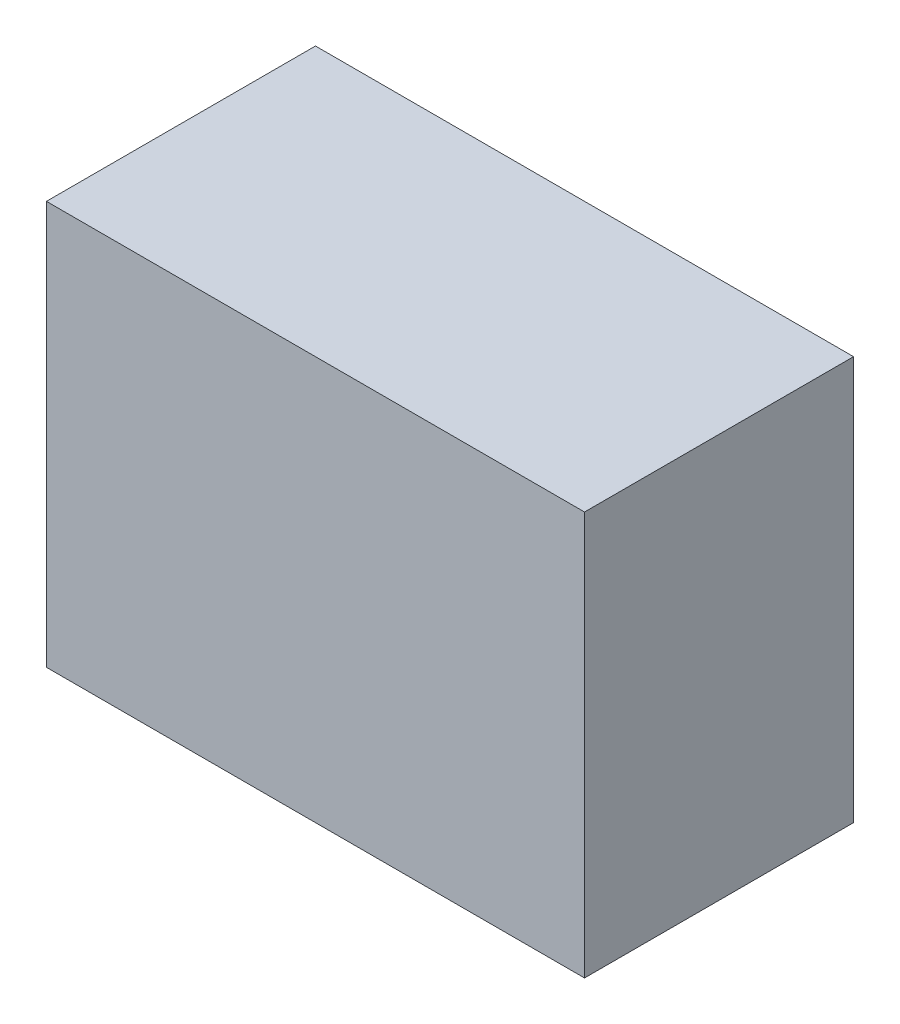
ISO-10303-21;
HEADER;
FILE_DESCRIPTION(('STEP AP214'),'2;1');
FILE_NAME('part.step','',(''),(''),'','','');
FILE_SCHEMA(('AUTOMOTIVE_DESIGN { 1 0 10303 214 1 1 1 1 }'));
ENDSEC;
DATA;
#1=APPLICATION_CONTEXT('core data for automotive mechanical design processes');
#2=APPLICATION_PROTOCOL_DEFINITION('international standard','automotive_design',2000,#1);
#3=PRODUCT_CONTEXT('',#1,'mechanical');
#4=PRODUCT('Part','Part','',(#3));
#5=PRODUCT_RELATED_PRODUCT_CATEGORY('part','',(#4));
#6=PRODUCT_DEFINITION_FORMATION('','',#4);
#7=PRODUCT_DEFINITION_CONTEXT('part definition',#1,'design');
#8=PRODUCT_DEFINITION('design','',#6,#7);
#9=PRODUCT_DEFINITION_SHAPE('','',#8);
#10=(LENGTH_UNIT() NAMED_UNIT(*) SI_UNIT(.MILLI.,.METRE.));
#11=(NAMED_UNIT(*) PLANE_ANGLE_UNIT() SI_UNIT($,.RADIAN.));
#12=(NAMED_UNIT(*) SI_UNIT($,.STERADIAN.) SOLID_ANGLE_UNIT());
#13=UNCERTAINTY_MEASURE_WITH_UNIT(LENGTH_MEASURE(1.E-05),#10,'distance_accuracy_value','');
#14=(GEOMETRIC_REPRESENTATION_CONTEXT(3) GLOBAL_UNCERTAINTY_ASSIGNED_CONTEXT((#13)) GLOBAL_UNIT_ASSIGNED_CONTEXT((#10,
#11,#12)) REPRESENTATION_CONTEXT('',''));
#15=CARTESIAN_POINT('',(0.,0.,0.));
#16=DIRECTION('',(0.,0.,1.));
#17=DIRECTION('',(1.,0.,0.));
#18=AXIS2_PLACEMENT_3D('',#15,#16,#17);
#19=CARTESIAN_POINT('',(200.,150.,-200.));
#20=DIRECTION('',(1.,0.,0.));
#21=DIRECTION('',(0.,1.,0.));
#22=AXIS2_PLACEMENT_3D('',#19,#20,#21);
#23=PLANE('',#22);
#24=DIRECTION('',(0.,1.,0.));
#25=VECTOR('',#24,1.);
#26=CARTESIAN_POINT('',(200.,150.,0.));
#27=LINE('',#26,#25);
#28=CARTESIAN_POINT('',(200.,-150.,0.));
#29=VERTEX_POINT('',#28);
#30=CARTESIAN_POINT('',(200.,150.,0.));
#31=VERTEX_POINT('',#30);
#32=EDGE_CURVE('E111',#29,#31,#27,.T.);
#33=ORIENTED_EDGE('',*,*,#32,.F.);
#34=DIRECTION('',(0.,0.,1.));
#35=VECTOR('',#34,1.);
#36=CARTESIAN_POINT('',(200.,-150.,-200.));
#37=LINE('',#36,#35);
#38=CARTESIAN_POINT('',(200.,-150.,-200.));
#39=VERTEX_POINT('',#38);
#40=EDGE_CURVE('E11',#39,#29,#37,.T.);
#41=ORIENTED_EDGE('',*,*,#40,.F.);
#42=DIRECTION('',(0.,1.,0.));
#43=VECTOR('',#42,1.);
#44=CARTESIAN_POINT('',(200.,150.,-200.));
#45=LINE('',#44,#43);
#46=CARTESIAN_POINT('',(200.,150.,-200.));
#47=VERTEX_POINT('',#46);
#48=EDGE_CURVE('E102',#39,#47,#45,.T.);
#49=ORIENTED_EDGE('',*,*,#48,.T.);
#50=DIRECTION('',(0.,0.,1.));
#51=VECTOR('',#50,1.);
#52=CARTESIAN_POINT('',(200.,150.,-200.));
#53=LINE('',#52,#51);
#54=EDGE_CURVE('E43',#47,#31,#53,.T.);
#55=ORIENTED_EDGE('',*,*,#54,.T.);
#56=EDGE_LOOP('',(#33,#41,#49,#55));
#57=FACE_BOUND('',#56,.T.);
#58=ADVANCED_FACE('F40',(#57),#23,.T.);
#59=CARTESIAN_POINT('',(-200.,-150.,-200.));
#60=DIRECTION('',(0.,-1.,0.));
#61=DIRECTION('',(0.,0.,-1.));
#62=AXIS2_PLACEMENT_3D('',#59,#60,#61);
#63=PLANE('',#62);
#64=DIRECTION('',(1.,0.,0.));
#65=VECTOR('',#64,1.);
#66=CARTESIAN_POINT('',(-200.,-150.,0.));
#67=LINE('',#66,#65);
#68=CARTESIAN_POINT('',(-200.,-150.,0.));
#69=VERTEX_POINT('',#68);
#70=EDGE_CURVE('E106',#69,#29,#67,.T.);
#71=ORIENTED_EDGE('',*,*,#70,.F.);
#72=DIRECTION('',(0.,0.,1.));
#73=VECTOR('',#72,1.);
#74=CARTESIAN_POINT('',(-200.,-150.,-200.));
#75=LINE('',#74,#73);
#76=CARTESIAN_POINT('',(-200.,-150.,-200.));
#77=VERTEX_POINT('',#76);
#78=EDGE_CURVE('E50',#77,#69,#75,.T.);
#79=ORIENTED_EDGE('',*,*,#78,.F.);
#80=DIRECTION('',(1.,0.,0.));
#81=VECTOR('',#80,1.);
#82=CARTESIAN_POINT('',(-200.,-150.,-200.));
#83=LINE('',#82,#81);
#84=EDGE_CURVE('E97',#77,#39,#83,.T.);
#85=ORIENTED_EDGE('',*,*,#84,.T.);
#86=ORIENTED_EDGE('',*,*,#40,.T.);
#87=EDGE_LOOP('',(#71,#79,#85,#86));
#88=FACE_BOUND('',#87,.T.);
#89=ADVANCED_FACE('F133',(#88),#63,.T.);
#90=CARTESIAN_POINT('',(-200.,150.,-200.));
#91=DIRECTION('',(-1.,0.,0.));
#92=DIRECTION('',(0.,-1.,0.));
#93=AXIS2_PLACEMENT_3D('',#90,#91,#92);
#94=PLANE('',#93);
#95=DIRECTION('',(0.,-1.,0.));
#96=VECTOR('',#95,1.);
#97=CARTESIAN_POINT('',(-200.,150.,0.));
#98=LINE('',#97,#96);
#99=CARTESIAN_POINT('',(-200.,150.,0.));
#100=VERTEX_POINT('',#99);
#101=EDGE_CURVE('E91',#100,#69,#98,.T.);
#102=ORIENTED_EDGE('',*,*,#101,.F.);
#103=DIRECTION('',(0.,0.,1.));
#104=VECTOR('',#103,1.);
#105=CARTESIAN_POINT('',(-200.,150.,-200.));
#106=LINE('',#105,#104);
#107=CARTESIAN_POINT('',(-200.,150.,-200.));
#108=VERTEX_POINT('',#107);
#109=EDGE_CURVE('E86',#108,#100,#106,.T.);
#110=ORIENTED_EDGE('',*,*,#109,.F.);
#111=DIRECTION('',(0.,-1.,0.));
#112=VECTOR('',#111,1.);
#113=CARTESIAN_POINT('',(-200.,150.,-200.));
#114=LINE('',#113,#112);
#115=EDGE_CURVE('E89',#108,#77,#114,.T.);
#116=ORIENTED_EDGE('',*,*,#115,.T.);
#117=ORIENTED_EDGE('',*,*,#78,.T.);
#118=EDGE_LOOP('',(#102,#110,#116,#117));
#119=FACE_BOUND('',#118,.T.);
#120=ADVANCED_FACE('F88',(#119),#94,.T.);
#121=CARTESIAN_POINT('',(-200.,150.,-200.));
#122=DIRECTION('',(0.,1.,0.));
#123=DIRECTION('',(0.,0.,1.));
#124=AXIS2_PLACEMENT_3D('',#121,#122,#123);
#125=PLANE('',#124);
#126=DIRECTION('',(-1.,0.,0.));
#127=VECTOR('',#126,1.);
#128=CARTESIAN_POINT('',(-200.,150.,0.));
#129=LINE('',#128,#127);
#130=EDGE_CURVE('E115',#31,#100,#129,.T.);
#131=ORIENTED_EDGE('',*,*,#130,.F.);
#132=ORIENTED_EDGE('',*,*,#54,.F.);
#133=DIRECTION('',(-1.,0.,0.));
#134=VECTOR('',#133,1.);
#135=CARTESIAN_POINT('',(-200.,150.,-200.));
#136=LINE('',#135,#134);
#137=EDGE_CURVE('E96',#47,#108,#136,.T.);
#138=ORIENTED_EDGE('',*,*,#137,.T.);
#139=ORIENTED_EDGE('',*,*,#109,.T.);
#140=EDGE_LOOP('',(#131,#132,#138,#139));
#141=FACE_BOUND('',#140,.T.);
#142=ADVANCED_FACE('F100',(#141),#125,.T.);
#143=CARTESIAN_POINT('',(0.,0.,-200.));
#144=DIRECTION('',(0.,0.,1.));
#145=DIRECTION('',(1.,0.,0.));
#146=AXIS2_PLACEMENT_3D('',#143,#144,#145);
#147=PLANE('',#146);
#148=ORIENTED_EDGE('',*,*,#48,.F.);
#149=ORIENTED_EDGE('',*,*,#84,.F.);
#150=ORIENTED_EDGE('',*,*,#115,.F.);
#151=ORIENTED_EDGE('',*,*,#137,.F.);
#152=EDGE_LOOP('',(#148,#149,#150,#151));
#153=FACE_BOUND('',#152,.T.);
#154=ADVANCED_FACE('F95',(#153),#147,.F.);
#155=CARTESIAN_POINT('',(0.,0.,0.));
#156=DIRECTION('',(0.,0.,1.));
#157=DIRECTION('',(1.,0.,0.));
#158=AXIS2_PLACEMENT_3D('',#155,#156,#157);
#159=PLANE('',#158);
#160=ORIENTED_EDGE('',*,*,#32,.T.);
#161=ORIENTED_EDGE('',*,*,#130,.T.);
#162=ORIENTED_EDGE('',*,*,#101,.T.);
#163=ORIENTED_EDGE('',*,*,#70,.T.);
#164=EDGE_LOOP('',(#160,#161,#162,#163));
#165=FACE_BOUND('',#164,.T.);
#166=ADVANCED_FACE('F132',(#165),#159,.T.);
#167=CLOSED_SHELL('',(#58,#89,#120,#142,#154,#166));
#168=MANIFOLD_SOLID_BREP('B2',#167);
#169=ADVANCED_BREP_SHAPE_REPRESENTATION('',(#18,#168),#14);
#170=SHAPE_DEFINITION_REPRESENTATION(#9,#169);
ENDSEC;
END-ISO-10303-21;
